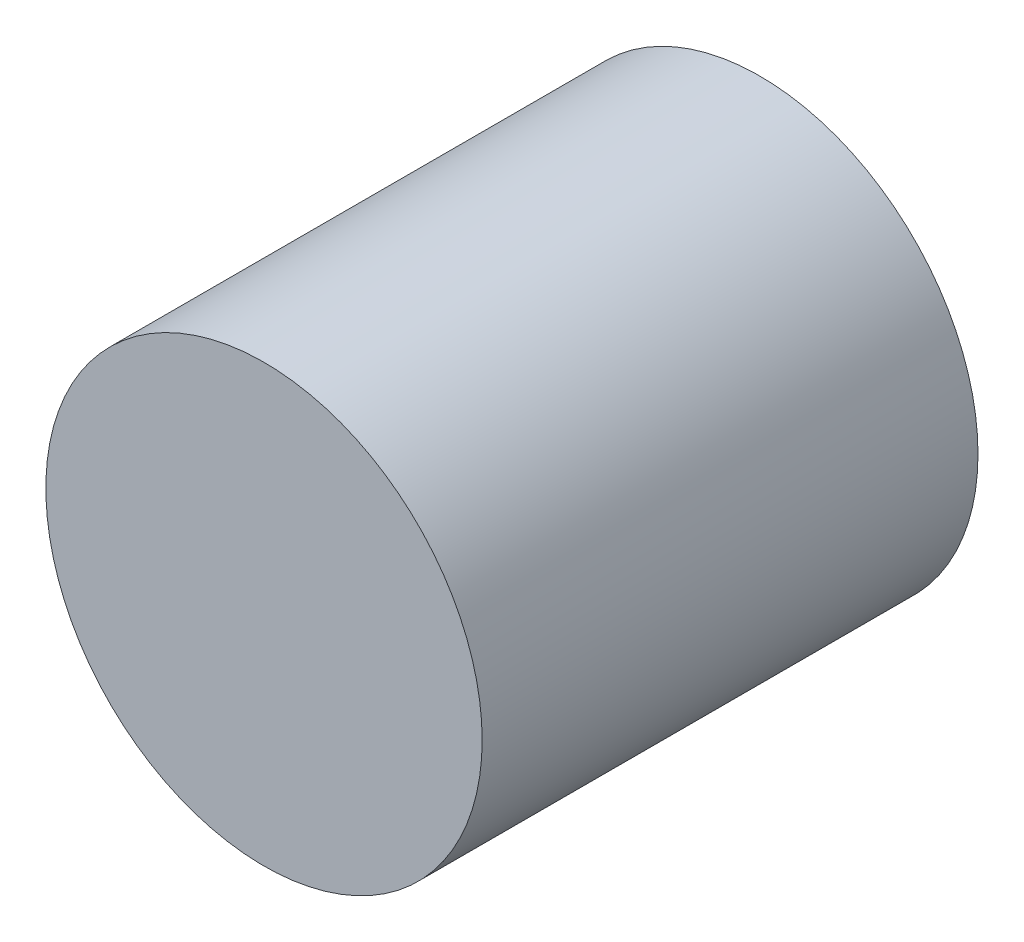
ISO-10303-21;
HEADER;
FILE_DESCRIPTION(('STEP AP214'),'2;1');
FILE_NAME('part.step','',(''),(''),'','','');
FILE_SCHEMA(('AUTOMOTIVE_DESIGN { 1 0 10303 214 1 1 1 1 }'));
ENDSEC;
DATA;
#1=APPLICATION_CONTEXT('core data for automotive mechanical design processes');
#2=APPLICATION_PROTOCOL_DEFINITION('international standard','automotive_design',2000,#1);
#3=PRODUCT_CONTEXT('',#1,'mechanical');
#4=PRODUCT('Part','Part','',(#3));
#5=PRODUCT_RELATED_PRODUCT_CATEGORY('part','',(#4));
#6=PRODUCT_DEFINITION_FORMATION('','',#4);
#7=PRODUCT_DEFINITION_CONTEXT('part definition',#1,'design');
#8=PRODUCT_DEFINITION('design','',#6,#7);
#9=PRODUCT_DEFINITION_SHAPE('','',#8);
#10=(LENGTH_UNIT() NAMED_UNIT(*) SI_UNIT(.MILLI.,.METRE.));
#11=(NAMED_UNIT(*) PLANE_ANGLE_UNIT() SI_UNIT($,.RADIAN.));
#12=(NAMED_UNIT(*) SI_UNIT($,.STERADIAN.) SOLID_ANGLE_UNIT());
#13=UNCERTAINTY_MEASURE_WITH_UNIT(LENGTH_MEASURE(1.E-05),#10,'distance_accuracy_value','');
#14=(GEOMETRIC_REPRESENTATION_CONTEXT(3) GLOBAL_UNCERTAINTY_ASSIGNED_CONTEXT((#13)) GLOBAL_UNIT_ASSIGNED_CONTEXT((#10,
#11,#12)) REPRESENTATION_CONTEXT('',''));
#15=CARTESIAN_POINT('',(0.,0.,0.));
#16=DIRECTION('',(0.,0.,1.));
#17=DIRECTION('',(1.,0.,0.));
#18=AXIS2_PLACEMENT_3D('',#15,#16,#17);
#19=CARTESIAN_POINT('',(0.,0.,63.5));
#20=DIRECTION('',(0.,0.,-1.));
#21=DIRECTION('',(-1.,0.,0.));
#22=AXIS2_PLACEMENT_3D('',#19,#20,#21);
#23=CYLINDRICAL_SURFACE('',#22,27.94);
#24=CARTESIAN_POINT('',(0.,0.,63.5));
#25=DIRECTION('',(0.,0.,1.));
#26=DIRECTION('',(1.,0.,0.));
#27=AXIS2_PLACEMENT_3D('',#24,#25,#26);
#28=CIRCLE('',#27,27.94);
#29=CARTESIAN_POINT('',(27.94,0.,63.5));
#30=VERTEX_POINT('',#29);
#31=EDGE_CURVE('E10',#30,#30,#28,.T.);
#32=ORIENTED_EDGE('',*,*,#31,.F.);
#33=EDGE_LOOP('',(#32));
#34=FACE_BOUND('',#33,.T.);
#35=CARTESIAN_POINT('',(0.,0.,0.));
#36=DIRECTION('',(0.,0.,1.));
#37=DIRECTION('',(1.,0.,0.));
#38=AXIS2_PLACEMENT_3D('',#35,#36,#37);
#39=CIRCLE('',#38,27.94);
#40=CARTESIAN_POINT('',(27.94,0.,0.));
#41=VERTEX_POINT('',#40);
#42=EDGE_CURVE('E38',#41,#41,#39,.T.);
#43=ORIENTED_EDGE('',*,*,#42,.T.);
#44=EDGE_LOOP('',(#43));
#45=FACE_BOUND('',#44,.T.);
#46=ADVANCED_FACE('F35',(#34,#45),#23,.T.);
#47=CARTESIAN_POINT('',(0.,0.,63.5));
#48=DIRECTION('',(0.,0.,1.));
#49=DIRECTION('',(1.,0.,0.));
#50=AXIS2_PLACEMENT_3D('',#47,#48,#49);
#51=PLANE('',#50);
#52=ORIENTED_EDGE('',*,*,#31,.T.);
#53=EDGE_LOOP('',(#52));
#54=FACE_BOUND('',#53,.T.);
#55=ADVANCED_FACE('F50',(#54),#51,.T.);
#56=CARTESIAN_POINT('',(0.,0.,0.));
#57=DIRECTION('',(0.,0.,1.));
#58=DIRECTION('',(1.,0.,0.));
#59=AXIS2_PLACEMENT_3D('',#56,#57,#58);
#60=PLANE('',#59);
#61=ORIENTED_EDGE('',*,*,#42,.F.);
#62=EDGE_LOOP('',(#61));
#63=FACE_BOUND('',#62,.T.);
#64=ADVANCED_FACE('F48',(#63),#60,.F.);
#65=CLOSED_SHELL('',(#46,#55,#64));
#66=MANIFOLD_SOLID_BREP('B2',#65);
#67=ADVANCED_BREP_SHAPE_REPRESENTATION('',(#18,#66),#14);
#68=SHAPE_DEFINITION_REPRESENTATION(#9,#67);
ENDSEC;
END-ISO-10303-21;
